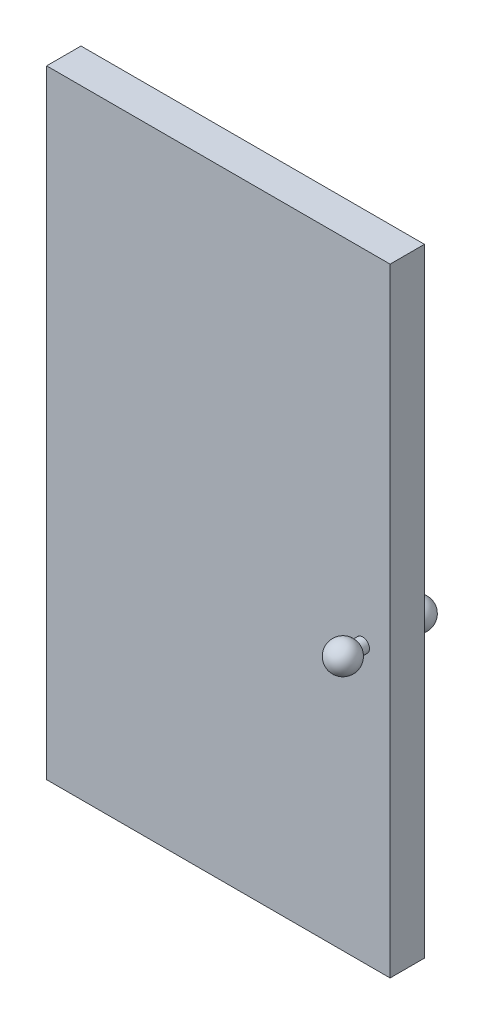
ISO-10303-21;
HEADER;
FILE_DESCRIPTION(('STEP AP214'),'2;1');
FILE_NAME('part.step','',(''),(''),'','','');
FILE_SCHEMA(('AUTOMOTIVE_DESIGN { 1 0 10303 214 1 1 1 1 }'));
ENDSEC;
DATA;
#1=APPLICATION_CONTEXT('core data for automotive mechanical design processes');
#2=APPLICATION_PROTOCOL_DEFINITION('international standard','automotive_design',2000,#1);
#3=PRODUCT_CONTEXT('',#1,'mechanical');
#4=PRODUCT('Part','Part','',(#3));
#5=PRODUCT_RELATED_PRODUCT_CATEGORY('part','',(#4));
#6=PRODUCT_DEFINITION_FORMATION('','',#4);
#7=PRODUCT_DEFINITION_CONTEXT('part definition',#1,'design');
#8=PRODUCT_DEFINITION('design','',#6,#7);
#9=PRODUCT_DEFINITION_SHAPE('','',#8);
#10=(LENGTH_UNIT() NAMED_UNIT(*) SI_UNIT(.MILLI.,.METRE.));
#11=(NAMED_UNIT(*) PLANE_ANGLE_UNIT() SI_UNIT($,.RADIAN.));
#12=(NAMED_UNIT(*) SI_UNIT($,.STERADIAN.) SOLID_ANGLE_UNIT());
#13=UNCERTAINTY_MEASURE_WITH_UNIT(LENGTH_MEASURE(1.E-05),#10,'distance_accuracy_value','');
#14=(GEOMETRIC_REPRESENTATION_CONTEXT(3) GLOBAL_UNCERTAINTY_ASSIGNED_CONTEXT((#13)) GLOBAL_UNIT_ASSIGNED_CONTEXT((#10,
#11,#12)) REPRESENTATION_CONTEXT('',''));
#15=CARTESIAN_POINT('',(0.,0.,0.));
#16=DIRECTION('',(0.,0.,1.));
#17=DIRECTION('',(1.,0.,0.));
#18=AXIS2_PLACEMENT_3D('',#15,#16,#17);
#19=CARTESIAN_POINT('',(-63.5,-114.3,-12.7));
#20=DIRECTION('',(-1.,0.,0.));
#21=DIRECTION('',(0.,0.,1.));
#22=AXIS2_PLACEMENT_3D('',#19,#20,#21);
#23=PLANE('',#22);
#24=DIRECTION('',(0.,-1.,0.));
#25=VECTOR('',#24,1.);
#26=CARTESIAN_POINT('',(-63.5,-114.3,0.));
#27=LINE('',#26,#25);
#28=CARTESIAN_POINT('',(-63.5,114.3,0.));
#29=VERTEX_POINT('',#28);
#30=CARTESIAN_POINT('',(-63.5,-114.3,0.));
#31=VERTEX_POINT('',#30);
#32=EDGE_CURVE('E107',#29,#31,#27,.T.);
#33=ORIENTED_EDGE('',*,*,#32,.F.);
#34=DIRECTION('',(0.,0.,1.));
#35=VECTOR('',#34,1.);
#36=CARTESIAN_POINT('',(-63.5,114.3,-12.7));
#37=LINE('',#36,#35);
#38=CARTESIAN_POINT('',(-63.5,114.3,-12.7));
#39=VERTEX_POINT('',#38);
#40=EDGE_CURVE('E47',#39,#29,#37,.T.);
#41=ORIENTED_EDGE('',*,*,#40,.F.);
#42=DIRECTION('',(0.,-1.,0.));
#43=VECTOR('',#42,1.);
#44=CARTESIAN_POINT('',(-63.5,-114.3,-12.7));
#45=LINE('',#44,#43);
#46=CARTESIAN_POINT('',(-63.5,-114.3,-12.7));
#47=VERTEX_POINT('',#46);
#48=EDGE_CURVE('E100',#39,#47,#45,.T.);
#49=ORIENTED_EDGE('',*,*,#48,.T.);
#50=DIRECTION('',(0.,0.,1.));
#51=VECTOR('',#50,1.);
#52=CARTESIAN_POINT('',(-63.5,-114.3,-12.7));
#53=LINE('',#52,#51);
#54=EDGE_CURVE('E83',#47,#31,#53,.T.);
#55=ORIENTED_EDGE('',*,*,#54,.T.);
#56=EDGE_LOOP('',(#33,#41,#49,#55));
#57=FACE_BOUND('',#56,.T.);
#58=ADVANCED_FACE('F37',(#57),#23,.T.);
#59=CARTESIAN_POINT('',(63.5,114.3,-12.7));
#60=DIRECTION('',(0.,1.,0.));
#61=DIRECTION('',(0.,0.,1.));
#62=AXIS2_PLACEMENT_3D('',#59,#60,#61);
#63=PLANE('',#62);
#64=DIRECTION('',(-1.,0.,0.));
#65=VECTOR('',#64,1.);
#66=CARTESIAN_POINT('',(63.5,114.3,0.));
#67=LINE('',#66,#65);
#68=CARTESIAN_POINT('',(63.5,114.3,0.));
#69=VERTEX_POINT('',#68);
#70=EDGE_CURVE('E102',#69,#29,#67,.T.);
#71=ORIENTED_EDGE('',*,*,#70,.F.);
#72=DIRECTION('',(0.,0.,1.));
#73=VECTOR('',#72,1.);
#74=CARTESIAN_POINT('',(63.5,114.3,-12.7));
#75=LINE('',#74,#73);
#76=CARTESIAN_POINT('',(63.5,114.3,-12.7));
#77=VERTEX_POINT('',#76);
#78=EDGE_CURVE('E72',#77,#69,#75,.T.);
#79=ORIENTED_EDGE('',*,*,#78,.F.);
#80=DIRECTION('',(-1.,0.,0.));
#81=VECTOR('',#80,1.);
#82=CARTESIAN_POINT('',(63.5,114.3,-12.7));
#83=LINE('',#82,#81);
#84=EDGE_CURVE('E97',#77,#39,#83,.T.);
#85=ORIENTED_EDGE('',*,*,#84,.T.);
#86=ORIENTED_EDGE('',*,*,#40,.T.);
#87=EDGE_LOOP('',(#71,#79,#85,#86));
#88=FACE_BOUND('',#87,.T.);
#89=ADVANCED_FACE('F142',(#88),#63,.T.);
#90=CARTESIAN_POINT('',(63.5,-114.3,-12.7));
#91=DIRECTION('',(1.,0.,0.));
#92=DIRECTION('',(0.,0.,-1.));
#93=AXIS2_PLACEMENT_3D('',#90,#91,#92);
#94=PLANE('',#93);
#95=DIRECTION('',(0.,1.,0.));
#96=VECTOR('',#95,1.);
#97=CARTESIAN_POINT('',(63.5,-114.3,0.));
#98=LINE('',#97,#96);
#99=CARTESIAN_POINT('',(63.5,-114.3,0.));
#100=VERTEX_POINT('',#99);
#101=EDGE_CURVE('E91',#100,#69,#98,.T.);
#102=ORIENTED_EDGE('',*,*,#101,.F.);
#103=DIRECTION('',(0.,0.,1.));
#104=VECTOR('',#103,1.);
#105=CARTESIAN_POINT('',(63.5,-114.3,-12.7));
#106=LINE('',#105,#104);
#107=CARTESIAN_POINT('',(63.5,-114.3,-12.7));
#108=VERTEX_POINT('',#107);
#109=EDGE_CURVE('E86',#108,#100,#106,.T.);
#110=ORIENTED_EDGE('',*,*,#109,.F.);
#111=DIRECTION('',(0.,1.,0.));
#112=VECTOR('',#111,1.);
#113=CARTESIAN_POINT('',(63.5,-114.3,-12.7));
#114=LINE('',#113,#112);
#115=EDGE_CURVE('E89',#108,#77,#114,.T.);
#116=ORIENTED_EDGE('',*,*,#115,.T.);
#117=ORIENTED_EDGE('',*,*,#78,.T.);
#118=EDGE_LOOP('',(#102,#110,#116,#117));
#119=FACE_BOUND('',#118,.T.);
#120=ADVANCED_FACE('F88',(#119),#94,.T.);
#121=CARTESIAN_POINT('',(63.5,-114.3,-12.7));
#122=DIRECTION('',(0.,-1.,0.));
#123=DIRECTION('',(1.,0.,0.));
#124=AXIS2_PLACEMENT_3D('',#121,#122,#123);
#125=PLANE('',#124);
#126=DIRECTION('',(1.,0.,0.));
#127=VECTOR('',#126,1.);
#128=CARTESIAN_POINT('',(63.5,-114.3,0.));
#129=LINE('',#128,#127);
#130=EDGE_CURVE('E110',#31,#100,#129,.T.);
#131=ORIENTED_EDGE('',*,*,#130,.F.);
#132=ORIENTED_EDGE('',*,*,#54,.F.);
#133=DIRECTION('',(1.,0.,0.));
#134=VECTOR('',#133,1.);
#135=CARTESIAN_POINT('',(63.5,-114.3,-12.7));
#136=LINE('',#135,#134);
#137=EDGE_CURVE('E96',#47,#108,#136,.T.);
#138=ORIENTED_EDGE('',*,*,#137,.T.);
#139=ORIENTED_EDGE('',*,*,#109,.T.);
#140=EDGE_LOOP('',(#131,#132,#138,#139));
#141=FACE_BOUND('',#140,.T.);
#142=ADVANCED_FACE('F99',(#141),#125,.T.);
#143=CARTESIAN_POINT('',(0.,0.,-12.7));
#144=DIRECTION('',(0.,0.,1.));
#145=DIRECTION('',(1.,0.,0.));
#146=AXIS2_PLACEMENT_3D('',#143,#144,#145);
#147=PLANE('',#146);
#148=CARTESIAN_POINT('',(53.34,-12.7,-12.7));
#149=DIRECTION('',(0.,0.,1.));
#150=DIRECTION('',(1.,0.,0.));
#151=AXIS2_PLACEMENT_3D('',#148,#149,#150);
#152=CIRCLE('',#151,2.54);
#153=CARTESIAN_POINT('',(55.88,-12.7,-12.7));
#154=VERTEX_POINT('',#153);
#155=EDGE_CURVE('E111',#154,#154,#152,.T.);
#156=ORIENTED_EDGE('',*,*,#155,.T.);
#157=EDGE_LOOP('',(#156));
#158=FACE_BOUND('',#157,.T.);
#159=ORIENTED_EDGE('',*,*,#48,.F.);
#160=ORIENTED_EDGE('',*,*,#84,.F.);
#161=ORIENTED_EDGE('',*,*,#115,.F.);
#162=ORIENTED_EDGE('',*,*,#137,.F.);
#163=EDGE_LOOP('',(#159,#160,#161,#162));
#164=FACE_BOUND('',#163,.T.);
#165=ADVANCED_FACE('F95',(#158,#164),#147,.F.);
#166=CARTESIAN_POINT('',(0.,0.,0.));
#167=DIRECTION('',(0.,0.,1.));
#168=DIRECTION('',(1.,0.,0.));
#169=AXIS2_PLACEMENT_3D('',#166,#167,#168);
#170=PLANE('',#169);
#171=CARTESIAN_POINT('',(53.34,-12.7,0.));
#172=DIRECTION('',(0.,0.,1.));
#173=DIRECTION('',(1.,0.,0.));
#174=AXIS2_PLACEMENT_3D('',#171,#172,#173);
#175=CIRCLE('',#174,2.54);
#176=CARTESIAN_POINT('',(55.88,-12.7,0.));
#177=VERTEX_POINT('',#176);
#178=EDGE_CURVE('E12',#177,#177,#175,.T.);
#179=ORIENTED_EDGE('',*,*,#178,.F.);
#180=EDGE_LOOP('',(#179));
#181=FACE_BOUND('',#180,.T.);
#182=ORIENTED_EDGE('',*,*,#32,.T.);
#183=ORIENTED_EDGE('',*,*,#130,.T.);
#184=ORIENTED_EDGE('',*,*,#101,.T.);
#185=ORIENTED_EDGE('',*,*,#70,.T.);
#186=EDGE_LOOP('',(#182,#183,#184,#185));
#187=FACE_BOUND('',#186,.T.);
#188=ADVANCED_FACE('F151',(#181,#187),#170,.T.);
#189=CARTESIAN_POINT('',(53.34,-12.7,7.3025));
#190=DIRECTION('',(0.,0.,1.));
#191=DIRECTION('',(1.,0.,0.));
#192=AXIS2_PLACEMENT_3D('',#189,#190,#191);
#193=SPHERICAL_SURFACE('',#192,5.3975);
#194=CARTESIAN_POINT('',(53.34,-12.7,2.54));
#195=DIRECTION('',(0.,0.,1.));
#196=DIRECTION('',(1.,0.,0.));
#197=AXIS2_PLACEMENT_3D('',#194,#195,#196);
#198=CIRCLE('',#197,2.54);
#199=CARTESIAN_POINT('',(55.88,-12.7,2.54));
#200=VERTEX_POINT('',#199);
#201=EDGE_CURVE('E118',#200,#200,#198,.T.);
#202=ORIENTED_EDGE('',*,*,#201,.T.);
#203=EDGE_LOOP('',(#202));
#204=FACE_BOUND('',#203,.T.);
#205=ADVANCED_FACE('F138',(#204),#193,.T.);
#206=CARTESIAN_POINT('',(53.34,-12.7,-24.9642048968553));
#207=DIRECTION('',(0.,0.,1.));
#208=DIRECTION('',(1.,0.,0.));
#209=AXIS2_PLACEMENT_3D('',#206,#207,#208);
#210=CYLINDRICAL_SURFACE('',#209,2.54);
#211=ORIENTED_EDGE('',*,*,#178,.T.);
#212=EDGE_LOOP('',(#211));
#213=FACE_BOUND('',#212,.T.);
#214=ORIENTED_EDGE('',*,*,#201,.F.);
#215=EDGE_LOOP('',(#214));
#216=FACE_BOUND('',#215,.T.);
#217=ADVANCED_FACE('F131',(#213,#216),#210,.T.);
#218=CARTESIAN_POINT('',(53.34,-12.7,-15.24));
#219=DIRECTION('',(0.,0.,1.));
#220=DIRECTION('',(1.,0.,0.));
#221=AXIS2_PLACEMENT_3D('',#218,#219,#220);
#222=CIRCLE('',#221,2.54);
#223=CARTESIAN_POINT('',(55.88,-12.7,-15.24));
#224=VERTEX_POINT('',#223);
#225=EDGE_CURVE('E41',#224,#224,#222,.F.);
#226=ORIENTED_EDGE('',*,*,#225,.F.);
#227=EDGE_LOOP('',(#226));
#228=FACE_BOUND('',#227,.T.);
#229=ORIENTED_EDGE('',*,*,#155,.F.);
#230=EDGE_LOOP('',(#229));
#231=FACE_BOUND('',#230,.T.);
#232=ADVANCED_FACE('F129',(#228,#231),#210,.T.);
#233=CARTESIAN_POINT('',(53.34,-12.7,-20.0025));
#234=DIRECTION('',(0.,0.,1.));
#235=DIRECTION('',(1.,0.,0.));
#236=AXIS2_PLACEMENT_3D('',#233,#234,#235);
#237=SPHERICAL_SURFACE('',#236,5.3975);
#238=ORIENTED_EDGE('',*,*,#225,.T.);
#239=EDGE_LOOP('',(#238));
#240=FACE_BOUND('',#239,.T.);
#241=ADVANCED_FACE('F39',(#240),#237,.T.);
#242=CLOSED_SHELL('',(#58,#89,#120,#142,#165,#188,#205,#217,#232,#241));
#243=MANIFOLD_SOLID_BREP('B2',#242);
#244=ADVANCED_BREP_SHAPE_REPRESENTATION('',(#18,#243),#14);
#245=SHAPE_DEFINITION_REPRESENTATION(#9,#244);
ENDSEC;
END-ISO-10303-21;
